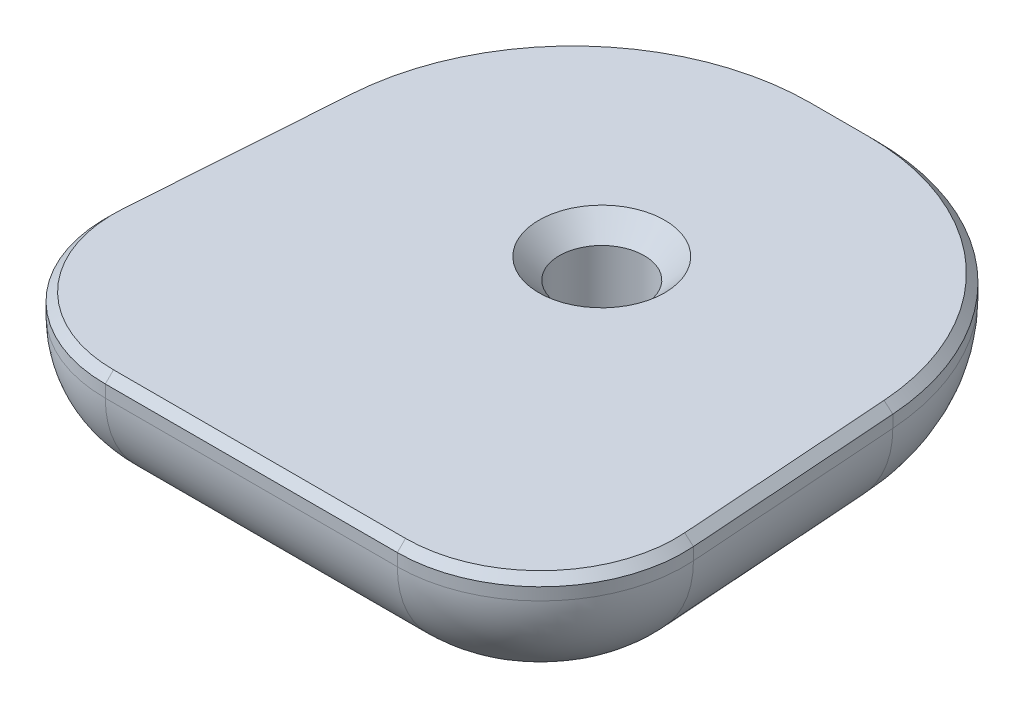
ISO-10303-21;
HEADER;
FILE_DESCRIPTION(('STEP AP214'),'2;1');
FILE_NAME('part.step','',(''),(''),'','','');
FILE_SCHEMA(('AUTOMOTIVE_DESIGN { 1 0 10303 214 1 1 1 1 }'));
ENDSEC;
DATA;
#1=APPLICATION_CONTEXT('core data for automotive mechanical design processes');
#2=APPLICATION_PROTOCOL_DEFINITION('international standard','automotive_design',2000,#1);
#3=PRODUCT_CONTEXT('',#1,'mechanical');
#4=PRODUCT('Part','Part','',(#3));
#5=PRODUCT_RELATED_PRODUCT_CATEGORY('part','',(#4));
#6=PRODUCT_DEFINITION_FORMATION('','',#4);
#7=PRODUCT_DEFINITION_CONTEXT('part definition',#1,'design');
#8=PRODUCT_DEFINITION('design','',#6,#7);
#9=PRODUCT_DEFINITION_SHAPE('','',#8);
#10=(LENGTH_UNIT() NAMED_UNIT(*) SI_UNIT(.MILLI.,.METRE.));
#11=(NAMED_UNIT(*) PLANE_ANGLE_UNIT() SI_UNIT($,.RADIAN.));
#12=(NAMED_UNIT(*) SI_UNIT($,.STERADIAN.) SOLID_ANGLE_UNIT());
#13=UNCERTAINTY_MEASURE_WITH_UNIT(LENGTH_MEASURE(1.E-05),#10,'distance_accuracy_value','');
#14=(GEOMETRIC_REPRESENTATION_CONTEXT(3) GLOBAL_UNCERTAINTY_ASSIGNED_CONTEXT((#13)) GLOBAL_UNIT_ASSIGNED_CONTEXT((#10,
#11,#12)) REPRESENTATION_CONTEXT('',''));
#15=CARTESIAN_POINT('',(0.,0.,0.));
#16=DIRECTION('',(0.,0.,1.));
#17=DIRECTION('',(1.,0.,0.));
#18=AXIS2_PLACEMENT_3D('',#15,#16,#17);
#19=CARTESIAN_POINT('',(-29.47436544682,164.,-24.29150949943));
#20=DIRECTION('',(0.,1.,0.));
#21=DIRECTION('',(1.,0.,0.));
#22=AXIS2_PLACEMENT_3D('',#19,#20,#21);
#23=PLANE('',#22);
#24=DIRECTION('',(1.,0.,0.));
#25=VECTOR('',#24,1.);
#26=CARTESIAN_POINT('',(-30.88930757944,164.,-56.));
#27=LINE('',#26,#25);
#28=CARTESIAN_POINT('',(-30.88930757944,164.,-56.));
#29=VERTEX_POINT('',#28);
#30=CARTESIAN_POINT('',(-28.05942331419,164.,-56.));
#31=VERTEX_POINT('',#30);
#32=EDGE_CURVE('E413',#29,#31,#27,.T.);
#33=ORIENTED_EDGE('',*,*,#32,.T.);
#34=CARTESIAN_POINT('',(-28.05942331419,164.,-49.));
#35=DIRECTION('',(0.,-1.,0.));
#36=DIRECTION('',(0.,0.,-1.));
#37=AXIS2_PLACEMENT_3D('',#34,#35,#36);
#38=CIRCLE('',#37,7.);
#39=CARTESIAN_POINT('',(-21.07647496236,164.,-49.48829531593));
#40=VERTEX_POINT('',#39);
#41=EDGE_CURVE('E286',#31,#40,#38,.T.);
#42=ORIENTED_EDGE('',*,*,#41,.T.);
#43=DIRECTION('',(0.0697564737049296,0.,0.997564050262565));
#44=VECTOR('',#43,1.);
#45=CARTESIAN_POINT('',(-21.07647496236,164.,-49.48829531593));
#46=LINE('',#45,#44);
#47=CARTESIAN_POINT('',(-20.34393573458,164.,-39.01249629361));
#48=VERTEX_POINT('',#47);
#49=EDGE_CURVE('E241',#40,#48,#46,.T.);
#50=ORIENTED_EDGE('',*,*,#49,.T.);
#51=CARTESIAN_POINT('',(-22.3390638351,164.,-38.8729833462));
#52=DIRECTION('',(0.,-1.,0.));
#53=DIRECTION('',(0.997564050262565,0.,-0.0697564737049296));
#54=AXIS2_PLACEMENT_3D('',#51,#52,#53);
#55=CIRCLE('',#54,2.);
#56=CARTESIAN_POINT('',(-22.3390638351,164.,-36.8729833462));
#57=VERTEX_POINT('',#56);
#58=EDGE_CURVE('E48',#48,#57,#55,.T.);
#59=ORIENTED_EDGE('',*,*,#58,.T.);
#60=DIRECTION('',(-1.,0.,0.));
#61=VECTOR('',#60,1.);
#62=CARTESIAN_POINT('',(-22.3390638351,164.,-36.8729833462));
#63=LINE('',#62,#61);
#64=CARTESIAN_POINT('',(-36.60966705853,164.,-36.8729833462));
#65=VERTEX_POINT('',#64);
#66=EDGE_CURVE('E423',#57,#65,#63,.T.);
#67=ORIENTED_EDGE('',*,*,#66,.T.);
#68=CARTESIAN_POINT('',(-36.60966705853,164.,-38.8729833462));
#69=DIRECTION('',(0.,-1.,0.));
#70=DIRECTION('',(0.,0.,1.));
#71=AXIS2_PLACEMENT_3D('',#68,#69,#70);
#72=CIRCLE('',#71,2.);
#73=CARTESIAN_POINT('',(-38.60479515906,164.,-39.01249629361));
#74=VERTEX_POINT('',#73);
#75=EDGE_CURVE('E229',#65,#74,#72,.T.);
#76=ORIENTED_EDGE('',*,*,#75,.T.);
#77=DIRECTION('',(0.0697564737049097,0.,-0.997564050262566));
#78=VECTOR('',#77,1.);
#79=CARTESIAN_POINT('',(-38.60479515906,164.,-39.01249629361));
#80=LINE('',#79,#78);
#81=CARTESIAN_POINT('',(-37.87225593128,164.,-49.48829531593));
#82=VERTEX_POINT('',#81);
#83=EDGE_CURVE('E386',#74,#82,#80,.T.);
#84=ORIENTED_EDGE('',*,*,#83,.T.);
#85=CARTESIAN_POINT('',(-30.88930757944,164.,-49.));
#86=DIRECTION('',(0.,-1.,0.));
#87=DIRECTION('',(-0.997564050262567,0.,-0.0697564737048997));
#88=AXIS2_PLACEMENT_3D('',#85,#86,#87);
#89=CIRCLE('',#88,7.);
#90=EDGE_CURVE('E390',#82,#29,#89,.T.);
#91=ORIENTED_EDGE('',*,*,#90,.T.);
#92=EDGE_LOOP('',(#33,#42,#50,#59,#67,#76,#84,#91));
#93=FACE_BOUND('',#92,.T.);
#94=CARTESIAN_POINT('',(-29.47436544682,164.,-49.));
#95=DIRECTION('',(0.,-1.,0.));
#96=DIRECTION('',(1.,0.,0.));
#97=AXIS2_PLACEMENT_3D('',#94,#95,#96);
#98=CIRCLE('',#97,3.075);
#99=CARTESIAN_POINT('',(-26.39936544682,164.,-49.));
#100=VERTEX_POINT('',#99);
#101=EDGE_CURVE('E10',#100,#100,#98,.T.);
#102=ORIENTED_EDGE('',*,*,#101,.F.);
#103=EDGE_LOOP('',(#102));
#104=FACE_BOUND('',#103,.T.);
#105=ADVANCED_FACE('F16',(#93,#104),#23,.F.);
#106=CARTESIAN_POINT('',(-29.47436544682,165.,-49.));
#107=DIRECTION('',(0.,-1.,0.));
#108=DIRECTION('',(1.,0.,0.));
#109=AXIS2_PLACEMENT_3D('',#106,#107,#108);
#110=CONICAL_SURFACE('',#109,2.075,0.785398163397);
#111=DIRECTION('',(-0.707106781186548,0.707106781186548,0.));
#112=VECTOR('',#111,1.);
#113=CARTESIAN_POINT('',(-27.39936544682,165.,-49.));
#114=LINE('',#113,#112);
#115=CARTESIAN_POINT('',(-27.39936544682,165.,-49.));
#116=VERTEX_POINT('',#115);
#117=EDGE_CURVE('E28',#100,#116,#114,.T.);
#118=ORIENTED_EDGE('',*,*,#117,.F.);
#119=ORIENTED_EDGE('',*,*,#101,.T.);
#120=ORIENTED_EDGE('',*,*,#117,.T.);
#121=CARTESIAN_POINT('',(-29.47436544682,165.,-49.));
#122=DIRECTION('',(0.,-1.,0.));
#123=DIRECTION('',(1.,0.,0.));
#124=AXIS2_PLACEMENT_3D('',#121,#122,#123);
#125=CIRCLE('',#124,2.075);
#126=EDGE_CURVE('E252',#116,#116,#125,.T.);
#127=ORIENTED_EDGE('',*,*,#126,.F.);
#128=EDGE_LOOP('',(#118,#119,#120,#127));
#129=FACE_BOUND('',#128,.T.);
#130=ADVANCED_FACE('F441',(#129),#110,.F.);
#131=CARTESIAN_POINT('',(-15.35611548326,169.,-39.36127866214));
#132=CARTESIAN_POINT('',(-15.35611548326,168.3455015305,-39.36127866214));
#133=CARTESIAN_POINT('',(-15.45867302411,167.69100415419,-39.35410714027));
#134=CARTESIAN_POINT('',(-15.6637907776,167.05668667135,-39.3397639097));
#135=CARTESIAN_POINT('',(-15.9661882197,166.4627621501,-39.31861822065));
#136=CARTESIAN_POINT('',(-16.35534126376,165.92726640012,-39.29140598894));
#137=CARTESIAN_POINT('',(-17.27868715931,165.001665788,-39.22683935417));
#138=CARTESIAN_POINT('',(-17.81287846856,164.61156247187,-39.18948505897));
#139=CARTESIAN_POINT('',(-18.40535621953,164.30842660604,-39.14805497872));
#140=CARTESIAN_POINT('',(-19.03812853686,164.1028079759,-39.10380722791));
#141=CARTESIAN_POINT('',(-19.69103159045,164.,-39.05815179889));
#142=CARTESIAN_POINT('',(-20.34393573458,164.,-39.01249629361));
#143=(BOUNDED_CURVE() B_SPLINE_CURVE(6,(#131,#132,#133,#134,#135,#136,#137,#138,#139,#140,#141,
#142),.UNSPECIFIED.,.F.,.F.) B_SPLINE_CURVE_WITH_KNOTS((7,5,7),(0.,0.785398163397,
1.570796326795),
.UNSPECIFIED.) CURVE() GEOMETRIC_REPRESENTATION_ITEM() RATIONAL_B_SPLINE_CURVE((1.,1.,1.,1.,1.,
1.,1.,1.,1.,1.,1.,1.)) REPRESENTATION_ITEM(''));
#144=CARTESIAN_POINT('',(-22.3390638351,169.,-38.8729833462));
#145=DIRECTION('',(0.,1.,0.));
#146=AXIS1_PLACEMENT('',#144,#145);
#147=SURFACE_OF_REVOLUTION('',#143,#146);
#148=CARTESIAN_POINT('',(-20.34393573458,169.,-39.01249629361));
#149=DIRECTION('',(-0.0697564737049296,0.,-0.997564050262565));
#150=DIRECTION('',(0.997564050262565,0.,-0.0697564737049296));
#151=AXIS2_PLACEMENT_3D('',#148,#149,#150);
#152=CIRCLE('',#151,5.);
#153=CARTESIAN_POINT('',(-15.35611548326,169.,-39.36127866214));
#154=VERTEX_POINT('',#153);
#155=EDGE_CURVE('E237',#154,#48,#152,.T.);
#156=ORIENTED_EDGE('',*,*,#155,.F.);
#157=CARTESIAN_POINT('',(-22.3390638351,169.,-38.8729833462));
#158=DIRECTION('',(0.,-1.,0.));
#159=DIRECTION('',(0.997564050262565,0.,-0.0697564737049296));
#160=AXIS2_PLACEMENT_3D('',#157,#158,#159);
#161=CIRCLE('',#160,7.);
#162=CARTESIAN_POINT('',(-22.3390638351,169.,-31.8729833462));
#163=VERTEX_POINT('',#162);
#164=EDGE_CURVE('E394',#154,#163,#161,.T.);
#165=ORIENTED_EDGE('',*,*,#164,.T.);
#166=CARTESIAN_POINT('',(-22.3390638351,169.,-36.8729833462));
#167=DIRECTION('',(1.,0.,0.));
#168=DIRECTION('',(0.,0.,1.));
#169=AXIS2_PLACEMENT_3D('',#166,#167,#168);
#170=CIRCLE('',#169,5.);
#171=EDGE_CURVE('E242',#163,#57,#170,.T.);
#172=ORIENTED_EDGE('',*,*,#171,.T.);
#173=ORIENTED_EDGE('',*,*,#58,.F.);
#174=EDGE_LOOP('',(#156,#165,#172,#173));
#175=FACE_BOUND('',#174,.T.);
#176=ADVANCED_FACE('F437',(#175),#147,.F.);
#177=CARTESIAN_POINT('',(-21.07647496236,169.,-49.48829531593));
#178=DIRECTION('',(0.0697564737049296,0.,0.997564050262565));
#179=DIRECTION('',(0.997564050262565,0.,-0.0697564737049296));
#180=AXIS2_PLACEMENT_3D('',#177,#178,#179);
#181=CYLINDRICAL_SURFACE('',#180,5.);
#182=DIRECTION('',(0.0697564737049296,0.,0.997564050262565));
#183=VECTOR('',#182,1.);
#184=CARTESIAN_POINT('',(-16.08865471104,169.,-49.83707768446));
#185=LINE('',#184,#183);
#186=CARTESIAN_POINT('',(-16.08865471104,169.,-49.83707768446));
#187=VERTEX_POINT('',#186);
#188=EDGE_CURVE('E385',#187,#154,#185,.T.);
#189=ORIENTED_EDGE('',*,*,#188,.T.);
#190=ORIENTED_EDGE('',*,*,#155,.T.);
#191=ORIENTED_EDGE('',*,*,#49,.F.);
#192=CARTESIAN_POINT('',(-21.07647496236,169.,-49.48829531593));
#193=DIRECTION('',(-0.0697564737049296,0.,-0.997564050262565));
#194=DIRECTION('',(0.997564050262565,0.,-0.0697564737049296));
#195=AXIS2_PLACEMENT_3D('',#192,#193,#194);
#196=CIRCLE('',#195,5.);
#197=EDGE_CURVE('E232',#187,#40,#196,.T.);
#198=ORIENTED_EDGE('',*,*,#197,.F.);
#199=EDGE_LOOP('',(#189,#190,#191,#198));
#200=FACE_BOUND('',#199,.T.);
#201=ADVANCED_FACE('F440',(#200),#181,.T.);
#202=CARTESIAN_POINT('',(-22.3390638351,169.,-36.8729833462));
#203=DIRECTION('',(-1.,0.,0.));
#204=DIRECTION('',(0.,0.,1.));
#205=AXIS2_PLACEMENT_3D('',#202,#203,#204);
#206=CYLINDRICAL_SURFACE('',#205,5.);
#207=DIRECTION('',(-1.,0.,0.));
#208=VECTOR('',#207,1.);
#209=CARTESIAN_POINT('',(-22.3390638351,169.,-31.8729833462));
#210=LINE('',#209,#208);
#211=CARTESIAN_POINT('',(-36.60966705853,169.,-31.8729833462));
#212=VERTEX_POINT('',#211);
#213=EDGE_CURVE('E376',#163,#212,#210,.T.);
#214=ORIENTED_EDGE('',*,*,#213,.T.);
#215=CARTESIAN_POINT('',(-36.60966705853,169.,-36.8729833462));
#216=DIRECTION('',(1.,0.,0.));
#217=DIRECTION('',(0.,0.,1.));
#218=AXIS2_PLACEMENT_3D('',#215,#216,#217);
#219=CIRCLE('',#218,5.);
#220=EDGE_CURVE('E233',#212,#65,#219,.T.);
#221=ORIENTED_EDGE('',*,*,#220,.T.);
#222=ORIENTED_EDGE('',*,*,#66,.F.);
#223=ORIENTED_EDGE('',*,*,#171,.F.);
#224=EDGE_LOOP('',(#214,#221,#222,#223));
#225=FACE_BOUND('',#224,.T.);
#226=ADVANCED_FACE('F449',(#225),#206,.T.);
#227=CARTESIAN_POINT('',(-28.05942331419,169.,-49.));
#228=DIRECTION('',(0.,-1.,0.));
#229=DIRECTION('',(0.,0.,-1.));
#230=AXIS2_PLACEMENT_3D('',#227,#228,#229);
#231=TOROIDAL_SURFACE('',#230,7.,5.);
#232=CARTESIAN_POINT('',(-28.05942331419,169.,-56.));
#233=DIRECTION('',(-1.,0.,0.));
#234=DIRECTION('',(0.,0.,-1.));
#235=AXIS2_PLACEMENT_3D('',#232,#233,#234);
#236=CIRCLE('',#235,5.);
#237=CARTESIAN_POINT('',(-28.05942331419,169.,-61.));
#238=VERTEX_POINT('',#237);
#239=EDGE_CURVE('E409',#238,#31,#236,.T.);
#240=ORIENTED_EDGE('',*,*,#239,.F.);
#241=CARTESIAN_POINT('',(-28.05942331419,169.,-49.));
#242=DIRECTION('',(0.,-1.,0.));
#243=DIRECTION('',(0.,0.,-1.));
#244=AXIS2_PLACEMENT_3D('',#241,#242,#243);
#245=CIRCLE('',#244,12.);
#246=EDGE_CURVE('E372',#238,#187,#245,.T.);
#247=ORIENTED_EDGE('',*,*,#246,.T.);
#248=ORIENTED_EDGE('',*,*,#197,.T.);
#249=ORIENTED_EDGE('',*,*,#41,.F.);
#250=EDGE_LOOP('',(#240,#247,#248,#249));
#251=FACE_BOUND('',#250,.T.);
#252=ADVANCED_FACE('F453',(#251),#231,.T.);
#253=CARTESIAN_POINT('',(-36.60966705853,169.,-31.8729833462));
#254=CARTESIAN_POINT('',(-36.60966705853,168.3455015305,-31.8729833462));
#255=CARTESIAN_POINT('',(-36.60966705853,167.69100415419,-31.97579132211));
#256=CARTESIAN_POINT('',(-36.60966705853,167.05668667135,-32.18140995225));
#257=CARTESIAN_POINT('',(-36.60966705853,166.4627621501,-32.48454581808));
#258=CARTESIAN_POINT('',(-36.60966705853,165.92726640012,-32.87464913421));
#259=CARTESIAN_POINT('',(-36.60966705853,165.001665788,-33.80024974633));
#260=CARTESIAN_POINT('',(-36.60966705853,164.61156247187,-34.33574549631));
#261=CARTESIAN_POINT('',(-36.60966705853,164.30842660604,-34.92967001756));
#262=CARTESIAN_POINT('',(-36.60966705853,164.1028079759,-35.5639875004));
#263=CARTESIAN_POINT('',(-36.60966705853,164.,-36.21848487671));
#264=CARTESIAN_POINT('',(-36.60966705853,164.,-36.8729833462));
#265=(BOUNDED_CURVE() B_SPLINE_CURVE(6,(#253,#254,#255,#256,#257,#258,#259,#260,#261,#262,#263,
#264),.UNSPECIFIED.,.F.,.F.) B_SPLINE_CURVE_WITH_KNOTS((7,5,7),(0.,0.785398163397,
1.570796326795),
.UNSPECIFIED.) CURVE() GEOMETRIC_REPRESENTATION_ITEM() RATIONAL_B_SPLINE_CURVE((1.,1.,1.,1.,1.,
1.,1.,1.,1.,1.,1.,1.)) REPRESENTATION_ITEM(''));
#266=CARTESIAN_POINT('',(-36.60966705853,169.,-38.8729833462));
#267=DIRECTION('',(0.,1.,0.));
#268=AXIS1_PLACEMENT('',#266,#267);
#269=SURFACE_OF_REVOLUTION('',#265,#268);
#270=ORIENTED_EDGE('',*,*,#220,.F.);
#271=CARTESIAN_POINT('',(-36.60966705853,169.,-38.8729833462));
#272=DIRECTION('',(0.,-1.,0.));
#273=DIRECTION('',(0.,0.,1.));
#274=AXIS2_PLACEMENT_3D('',#271,#272,#273);
#275=CIRCLE('',#274,7.);
#276=CARTESIAN_POINT('',(-43.59261541037,169.,-39.36127866214));
#277=VERTEX_POINT('',#276);
#278=EDGE_CURVE('E360',#212,#277,#275,.T.);
#279=ORIENTED_EDGE('',*,*,#278,.T.);
#280=CARTESIAN_POINT('',(-38.60479515906,169.,-39.01249629361));
#281=DIRECTION('',(-0.0697564737048997,0.,0.997564050262567));
#282=DIRECTION('',(-0.997564050262567,0.,-0.0697564737048997));
#283=AXIS2_PLACEMENT_3D('',#280,#281,#282);
#284=CIRCLE('',#283,5.);
#285=EDGE_CURVE('E389',#277,#74,#284,.T.);
#286=ORIENTED_EDGE('',*,*,#285,.T.);
#287=ORIENTED_EDGE('',*,*,#75,.F.);
#288=EDGE_LOOP('',(#270,#279,#286,#287));
#289=FACE_BOUND('',#288,.T.);
#290=ADVANCED_FACE('F18',(#289),#269,.F.);
#291=CARTESIAN_POINT('',(-30.88930757944,169.,-56.));
#292=DIRECTION('',(1.,0.,0.));
#293=DIRECTION('',(0.,0.,-1.));
#294=AXIS2_PLACEMENT_3D('',#291,#292,#293);
#295=CYLINDRICAL_SURFACE('',#294,5.);
#296=DIRECTION('',(1.,0.,0.));
#297=VECTOR('',#296,1.);
#298=CARTESIAN_POINT('',(-30.88930757944,169.,-61.));
#299=LINE('',#298,#297);
#300=CARTESIAN_POINT('',(-30.88930757944,169.,-61.));
#301=VERTEX_POINT('',#300);
#302=EDGE_CURVE('E356',#301,#238,#299,.T.);
#303=ORIENTED_EDGE('',*,*,#302,.T.);
#304=ORIENTED_EDGE('',*,*,#239,.T.);
#305=ORIENTED_EDGE('',*,*,#32,.F.);
#306=CARTESIAN_POINT('',(-30.88930757944,169.,-56.));
#307=DIRECTION('',(-1.,0.,0.));
#308=DIRECTION('',(0.,0.,-1.));
#309=AXIS2_PLACEMENT_3D('',#306,#307,#308);
#310=CIRCLE('',#309,5.);
#311=EDGE_CURVE('E251',#301,#29,#310,.T.);
#312=ORIENTED_EDGE('',*,*,#311,.F.);
#313=EDGE_LOOP('',(#303,#304,#305,#312));
#314=FACE_BOUND('',#313,.T.);
#315=ADVANCED_FACE('F458',(#314),#295,.T.);
#316=CARTESIAN_POINT('',(-38.60479515906,169.,-39.01249629361));
#317=DIRECTION('',(0.0697564737049097,0.,-0.997564050262566));
#318=DIRECTION('',(-0.997564050262566,0.,-0.0697564737049097));
#319=AXIS2_PLACEMENT_3D('',#316,#317,#318);
#320=CYLINDRICAL_SURFACE('',#319,5.);
#321=DIRECTION('',(0.0697564737049097,0.,-0.997564050262566));
#322=VECTOR('',#321,1.);
#323=CARTESIAN_POINT('',(-43.59261541037,169.,-39.36127866214));
#324=LINE('',#323,#322);
#325=CARTESIAN_POINT('',(-42.86007618259,169.,-49.83707768445));
#326=VERTEX_POINT('',#325);
#327=EDGE_CURVE('E348',#277,#326,#324,.T.);
#328=ORIENTED_EDGE('',*,*,#327,.T.);
#329=CARTESIAN_POINT('',(-37.87225593128,169.,-49.48829531593));
#330=DIRECTION('',(-0.0697564737048997,0.,0.997564050262567));
#331=DIRECTION('',(-0.997564050262567,0.,-0.0697564737048997));
#332=AXIS2_PLACEMENT_3D('',#329,#330,#331);
#333=CIRCLE('',#332,5.);
#334=EDGE_CURVE('E247',#326,#82,#333,.T.);
#335=ORIENTED_EDGE('',*,*,#334,.T.);
#336=ORIENTED_EDGE('',*,*,#83,.F.);
#337=ORIENTED_EDGE('',*,*,#285,.F.);
#338=EDGE_LOOP('',(#328,#335,#336,#337));
#339=FACE_BOUND('',#338,.T.);
#340=ADVANCED_FACE('F461',(#339),#320,.T.);
#341=CARTESIAN_POINT('',(-30.88930757944,169.,-49.));
#342=DIRECTION('',(0.,-1.,0.));
#343=DIRECTION('',(-0.997564050262567,0.,-0.0697564737048997));
#344=AXIS2_PLACEMENT_3D('',#341,#342,#343);
#345=TOROIDAL_SURFACE('',#344,7.,5.);
#346=ORIENTED_EDGE('',*,*,#334,.F.);
#347=CARTESIAN_POINT('',(-30.88930757944,169.,-49.));
#348=DIRECTION('',(0.,-1.,0.));
#349=DIRECTION('',(-0.997564050262567,0.,-0.0697564737048997));
#350=AXIS2_PLACEMENT_3D('',#347,#348,#349);
#351=CIRCLE('',#350,12.);
#352=EDGE_CURVE('E336',#326,#301,#351,.T.);
#353=ORIENTED_EDGE('',*,*,#352,.T.);
#354=ORIENTED_EDGE('',*,*,#311,.T.);
#355=ORIENTED_EDGE('',*,*,#90,.F.);
#356=EDGE_LOOP('',(#346,#353,#354,#355));
#357=FACE_BOUND('',#356,.T.);
#358=ADVANCED_FACE('F465',(#357),#345,.T.);
#359=CARTESIAN_POINT('',(-29.47436544682,164.,-49.));
#360=DIRECTION('',(0.,-1.,0.));
#361=DIRECTION('',(1.,0.,0.));
#362=AXIS2_PLACEMENT_3D('',#359,#360,#361);
#363=CYLINDRICAL_SURFACE('',#362,2.075);
#364=CARTESIAN_POINT('',(-29.47436544682,169.,-49.));
#365=DIRECTION('',(0.,-1.,0.));
#366=DIRECTION('',(1.,0.,0.));
#367=AXIS2_PLACEMENT_3D('',#364,#365,#366);
#368=CIRCLE('',#367,2.075);
#369=CARTESIAN_POINT('',(-27.39936544682,169.,-49.));
#370=VERTEX_POINT('',#369);
#371=EDGE_CURVE('E320',#370,#370,#368,.T.);
#372=ORIENTED_EDGE('',*,*,#371,.F.);
#373=DIRECTION('',(0.,1.,0.));
#374=VECTOR('',#373,1.);
#375=CARTESIAN_POINT('',(-27.39936544682,164.,-49.));
#376=LINE('',#375,#374);
#377=EDGE_CURVE('E332',#116,#370,#376,.T.);
#378=ORIENTED_EDGE('',*,*,#377,.F.);
#379=ORIENTED_EDGE('',*,*,#126,.T.);
#380=ORIENTED_EDGE('',*,*,#377,.T.);
#381=EDGE_LOOP('',(#372,#378,#379,#380));
#382=FACE_BOUND('',#381,.T.);
#383=ADVANCED_FACE('F469',(#382),#363,.F.);
#384=CARTESIAN_POINT('',(-22.3390638351,170.,-38.8729833462));
#385=DIRECTION('',(0.,-1.,0.));
#386=DIRECTION('',(0.,0.,1.));
#387=AXIS2_PLACEMENT_3D('',#384,#385,#386);
#388=CYLINDRICAL_SURFACE('',#387,7.);
#389=ORIENTED_EDGE('',*,*,#164,.F.);
#390=DIRECTION('',(0.,-1.,0.));
#391=VECTOR('',#390,1.);
#392=CARTESIAN_POINT('',(-15.35611548326,170.,-39.36127866214));
#393=LINE('',#392,#391);
#394=CARTESIAN_POINT('',(-15.35611548326,169.6,-39.36127866214));
#395=VERTEX_POINT('',#394);
#396=EDGE_CURVE('E381',#395,#154,#393,.T.);
#397=ORIENTED_EDGE('',*,*,#396,.F.);
#398=CARTESIAN_POINT('',(-22.3390638351,169.6,-38.8729833462));
#399=DIRECTION('',(0.,-1.,0.));
#400=DIRECTION('',(0.997564050262565,0.,-0.0697564737049296));
#401=AXIS2_PLACEMENT_3D('',#398,#399,#400);
#402=CIRCLE('',#401,7.);
#403=CARTESIAN_POINT('',(-22.3390638351,169.6,-31.8729833462));
#404=VERTEX_POINT('',#403);
#405=EDGE_CURVE('E316',#395,#404,#402,.T.);
#406=ORIENTED_EDGE('',*,*,#405,.T.);
#407=DIRECTION('',(0.,-1.,0.));
#408=VECTOR('',#407,1.);
#409=CARTESIAN_POINT('',(-22.3390638351,170.,-31.8729833462));
#410=LINE('',#409,#408);
#411=EDGE_CURVE('E377',#404,#163,#410,.T.);
#412=ORIENTED_EDGE('',*,*,#411,.T.);
#413=EDGE_LOOP('',(#389,#397,#406,#412));
#414=FACE_BOUND('',#413,.T.);
#415=ADVANCED_FACE('F471',(#414),#388,.T.);
#416=CARTESIAN_POINT('',(-14.83248286523,170.,-31.8729833462));
#417=DIRECTION('',(0.997564050262565,0.,-0.0697564737049296));
#418=DIRECTION('',(0.,-1.,0.));
#419=AXIS2_PLACEMENT_3D('',#416,#417,#418);
#420=PLANE('',#419);
#421=ORIENTED_EDGE('',*,*,#396,.T.);
#422=ORIENTED_EDGE('',*,*,#188,.F.);
#423=DIRECTION('',(0.,-1.,0.));
#424=VECTOR('',#423,1.);
#425=CARTESIAN_POINT('',(-16.08865471104,170.,-49.83707768446));
#426=LINE('',#425,#424);
#427=CARTESIAN_POINT('',(-16.08865471104,169.6,-49.83707768446));
#428=VERTEX_POINT('',#427);
#429=EDGE_CURVE('E368',#428,#187,#426,.T.);
#430=ORIENTED_EDGE('',*,*,#429,.F.);
#431=DIRECTION('',(0.0697564737049296,0.,0.997564050262565));
#432=VECTOR('',#431,1.);
#433=CARTESIAN_POINT('',(-16.08865471104,169.6,-49.83707768446));
#434=LINE('',#433,#432);
#435=EDGE_CURVE('E312',#428,#395,#434,.T.);
#436=ORIENTED_EDGE('',*,*,#435,.T.);
#437=EDGE_LOOP('',(#421,#422,#430,#436));
#438=FACE_BOUND('',#437,.T.);
#439=ADVANCED_FACE('F474',(#438),#420,.T.);
#440=CARTESIAN_POINT('',(-14.83248286523,170.,-31.8729833462));
#441=DIRECTION('',(0.,0.,-1.));
#442=DIRECTION('',(0.,-1.,0.));
#443=AXIS2_PLACEMENT_3D('',#440,#441,#442);
#444=PLANE('',#443);
#445=DIRECTION('',(-1.,0.,0.));
#446=VECTOR('',#445,1.);
#447=CARTESIAN_POINT('',(-22.3390638351,169.6,-31.8729833462));
#448=LINE('',#447,#446);
#449=CARTESIAN_POINT('',(-36.60966705853,169.6,-31.8729833462));
#450=VERTEX_POINT('',#449);
#451=EDGE_CURVE('E304',#404,#450,#448,.T.);
#452=ORIENTED_EDGE('',*,*,#451,.T.);
#453=DIRECTION('',(0.,-1.,0.));
#454=VECTOR('',#453,1.);
#455=CARTESIAN_POINT('',(-36.60966705853,170.,-31.8729833462));
#456=LINE('',#455,#454);
#457=EDGE_CURVE('E364',#450,#212,#456,.T.);
#458=ORIENTED_EDGE('',*,*,#457,.T.);
#459=ORIENTED_EDGE('',*,*,#213,.F.);
#460=ORIENTED_EDGE('',*,*,#411,.F.);
#461=EDGE_LOOP('',(#452,#458,#459,#460));
#462=FACE_BOUND('',#461,.T.);
#463=ADVANCED_FACE('F478',(#462),#444,.F.);
#464=CARTESIAN_POINT('',(-28.05942331419,170.,-49.));
#465=DIRECTION('',(0.,1.,0.));
#466=DIRECTION('',(0.,0.,-1.));
#467=AXIS2_PLACEMENT_3D('',#464,#465,#466);
#468=CYLINDRICAL_SURFACE('',#467,12.);
#469=ORIENTED_EDGE('',*,*,#429,.T.);
#470=ORIENTED_EDGE('',*,*,#246,.F.);
#471=DIRECTION('',(0.,-1.,0.));
#472=VECTOR('',#471,1.);
#473=CARTESIAN_POINT('',(-28.05942331419,170.,-61.));
#474=LINE('',#473,#472);
#475=CARTESIAN_POINT('',(-28.05942331419,169.6,-61.));
#476=VERTEX_POINT('',#475);
#477=EDGE_CURVE('E352',#476,#238,#474,.T.);
#478=ORIENTED_EDGE('',*,*,#477,.F.);
#479=CARTESIAN_POINT('',(-28.05942331419,169.6,-49.));
#480=DIRECTION('',(0.,-1.,0.));
#481=DIRECTION('',(0.,0.,-1.));
#482=AXIS2_PLACEMENT_3D('',#479,#480,#481);
#483=CIRCLE('',#482,12.);
#484=EDGE_CURVE('E296',#476,#428,#483,.T.);
#485=ORIENTED_EDGE('',*,*,#484,.T.);
#486=EDGE_LOOP('',(#469,#470,#478,#485));
#487=FACE_BOUND('',#486,.T.);
#488=ADVANCED_FACE('F482',(#487),#468,.T.);
#489=CARTESIAN_POINT('',(-36.60966705853,170.,-38.8729833462));
#490=DIRECTION('',(0.,-1.,0.));
#491=DIRECTION('',(-0.997564050262566,0.,-0.0697564737049097));
#492=AXIS2_PLACEMENT_3D('',#489,#490,#491);
#493=CYLINDRICAL_SURFACE('',#492,7.);
#494=ORIENTED_EDGE('',*,*,#278,.F.);
#495=ORIENTED_EDGE('',*,*,#457,.F.);
#496=CARTESIAN_POINT('',(-36.60966705853,169.6,-38.8729833462));
#497=DIRECTION('',(0.,-1.,0.));
#498=DIRECTION('',(0.,0.,1.));
#499=AXIS2_PLACEMENT_3D('',#496,#497,#498);
#500=CIRCLE('',#499,7.);
#501=CARTESIAN_POINT('',(-43.59261541037,169.6,-39.36127866214));
#502=VERTEX_POINT('',#501);
#503=EDGE_CURVE('E282',#450,#502,#500,.T.);
#504=ORIENTED_EDGE('',*,*,#503,.T.);
#505=DIRECTION('',(0.,-1.,0.));
#506=VECTOR('',#505,1.);
#507=CARTESIAN_POINT('',(-43.59261541037,170.,-39.36127866214));
#508=LINE('',#507,#506);
#509=EDGE_CURVE('E344',#502,#277,#508,.T.);
#510=ORIENTED_EDGE('',*,*,#509,.T.);
#511=EDGE_LOOP('',(#494,#495,#504,#510));
#512=FACE_BOUND('',#511,.T.);
#513=ADVANCED_FACE('F484',(#512),#493,.T.);
#514=CARTESIAN_POINT('',(-28.05942331419,170.,-61.));
#515=DIRECTION('',(0.,0.,-1.));
#516=DIRECTION('',(0.,-1.,0.));
#517=AXIS2_PLACEMENT_3D('',#514,#515,#516);
#518=PLANE('',#517);
#519=ORIENTED_EDGE('',*,*,#477,.T.);
#520=ORIENTED_EDGE('',*,*,#302,.F.);
#521=DIRECTION('',(0.,-1.,0.));
#522=VECTOR('',#521,1.);
#523=CARTESIAN_POINT('',(-30.88930757944,170.,-61.));
#524=LINE('',#523,#522);
#525=CARTESIAN_POINT('',(-30.88930757944,169.6,-61.));
#526=VERTEX_POINT('',#525);
#527=EDGE_CURVE('E328',#526,#301,#524,.T.);
#528=ORIENTED_EDGE('',*,*,#527,.F.);
#529=DIRECTION('',(1.,0.,0.));
#530=VECTOR('',#529,1.);
#531=CARTESIAN_POINT('',(-30.88930757944,169.6,-61.));
#532=LINE('',#531,#530);
#533=EDGE_CURVE('E253',#526,#476,#532,.T.);
#534=ORIENTED_EDGE('',*,*,#533,.T.);
#535=EDGE_LOOP('',(#519,#520,#528,#534));
#536=FACE_BOUND('',#535,.T.);
#537=ADVANCED_FACE('F487',(#536),#518,.T.);
#538=CARTESIAN_POINT('',(-42.86007618259,170.,-49.83707768445));
#539=DIRECTION('',(-0.997564050262566,0.,-0.0697564737049097));
#540=DIRECTION('',(-0.0697564737049097,0.,0.997564050262566));
#541=AXIS2_PLACEMENT_3D('',#538,#539,#540);
#542=PLANE('',#541);
#543=ORIENTED_EDGE('',*,*,#509,.F.);
#544=DIRECTION('',(0.0697564737049097,0.,-0.997564050262566));
#545=VECTOR('',#544,1.);
#546=CARTESIAN_POINT('',(-43.59261541037,169.6,-39.36127866214));
#547=LINE('',#546,#545);
#548=CARTESIAN_POINT('',(-42.86007618259,169.6,-49.83707768445));
#549=VERTEX_POINT('',#548);
#550=EDGE_CURVE('E228',#502,#549,#547,.T.);
#551=ORIENTED_EDGE('',*,*,#550,.T.);
#552=DIRECTION('',(0.,-1.,0.));
#553=VECTOR('',#552,1.);
#554=CARTESIAN_POINT('',(-42.86007618259,170.,-49.83707768445));
#555=LINE('',#554,#553);
#556=EDGE_CURVE('E340',#549,#326,#555,.T.);
#557=ORIENTED_EDGE('',*,*,#556,.T.);
#558=ORIENTED_EDGE('',*,*,#327,.F.);
#559=EDGE_LOOP('',(#543,#551,#557,#558));
#560=FACE_BOUND('',#559,.T.);
#561=ADVANCED_FACE('F492',(#560),#542,.T.);
#562=CARTESIAN_POINT('',(-30.88930757944,170.,-49.));
#563=DIRECTION('',(0.,1.,0.));
#564=DIRECTION('',(0.,0.,-1.));
#565=AXIS2_PLACEMENT_3D('',#562,#563,#564);
#566=CYLINDRICAL_SURFACE('',#565,12.);
#567=CARTESIAN_POINT('',(-30.88930757944,169.6,-49.));
#568=DIRECTION('',(0.,-1.,0.));
#569=DIRECTION('',(-0.997564050262567,0.,-0.0697564737048997));
#570=AXIS2_PLACEMENT_3D('',#567,#568,#569);
#571=CIRCLE('',#570,12.);
#572=EDGE_CURVE('E194',#549,#526,#571,.T.);
#573=ORIENTED_EDGE('',*,*,#572,.T.);
#574=ORIENTED_EDGE('',*,*,#527,.T.);
#575=ORIENTED_EDGE('',*,*,#352,.F.);
#576=ORIENTED_EDGE('',*,*,#556,.F.);
#577=EDGE_LOOP('',(#573,#574,#575,#576));
#578=FACE_BOUND('',#577,.T.);
#579=ADVANCED_FACE('F495',(#578),#566,.T.);
#580=CARTESIAN_POINT('',(-29.47436544682,169.,-49.));
#581=DIRECTION('',(0.,1.,0.));
#582=DIRECTION('',(1.,0.,0.));
#583=AXIS2_PLACEMENT_3D('',#580,#581,#582);
#584=CONICAL_SURFACE('',#583,2.075,0.785398163397);
#585=ORIENTED_EDGE('',*,*,#371,.T.);
#586=DIRECTION('',(-0.707106781186548,-0.707106781186548,0.));
#587=VECTOR('',#586,1.);
#588=CARTESIAN_POINT('',(-27.39936544682,169.,-49.));
#589=LINE('',#588,#587);
#590=CARTESIAN_POINT('',(-26.39936544682,170.,-49.));
#591=VERTEX_POINT('',#590);
#592=EDGE_CURVE('E324',#591,#370,#589,.T.);
#593=ORIENTED_EDGE('',*,*,#592,.F.);
#594=CARTESIAN_POINT('',(-29.47436544682,170.,-49.));
#595=DIRECTION('',(0.,-1.,0.));
#596=DIRECTION('',(1.,0.,0.));
#597=AXIS2_PLACEMENT_3D('',#594,#595,#596);
#598=CIRCLE('',#597,3.075);
#599=EDGE_CURVE('E199',#591,#591,#598,.T.);
#600=ORIENTED_EDGE('',*,*,#599,.F.);
#601=ORIENTED_EDGE('',*,*,#592,.T.);
#602=EDGE_LOOP('',(#585,#593,#600,#601));
#603=FACE_BOUND('',#602,.T.);
#604=ADVANCED_FACE('F502',(#603),#584,.F.);
#605=CARTESIAN_POINT('',(-22.3390638351,169.6,-38.8729833462));
#606=DIRECTION('',(0.,-1.,0.));
#607=DIRECTION('',(0.997564050262565,0.,-0.0697564737049296));
#608=AXIS2_PLACEMENT_3D('',#605,#606,#607);
#609=CONICAL_SURFACE('',#608,7.,0.785398163397);
#610=DIRECTION('',(0.705384304608563,-0.707106781186562,-0.0493252755884095));
#611=VECTOR('',#610,1.);
#612=CARTESIAN_POINT('',(-15.55562829332,169.8,-39.3473273674));
#613=LINE('',#612,#611);
#614=CARTESIAN_POINT('',(-15.75514110337,170.,-39.33337607266));
#615=VERTEX_POINT('',#614);
#616=EDGE_CURVE('E308',#615,#395,#613,.T.);
#617=ORIENTED_EDGE('',*,*,#616,.F.);
#618=CARTESIAN_POINT('',(-22.3390638351,170.,-38.8729833462));
#619=DIRECTION('',(0.,-1.,0.));
#620=DIRECTION('',(0.997564050262565,0.,-0.0697564737049296));
#621=AXIS2_PLACEMENT_3D('',#618,#619,#620);
#622=CIRCLE('',#621,6.6);
#623=CARTESIAN_POINT('',(-22.3390638351,170.,-32.2729833462));
#624=VERTEX_POINT('',#623);
#625=EDGE_CURVE('E246',#615,#624,#622,.T.);
#626=ORIENTED_EDGE('',*,*,#625,.T.);
#627=DIRECTION('',(0.,-0.707106781186548,0.707106781186548));
#628=VECTOR('',#627,1.);
#629=CARTESIAN_POINT('',(-22.3390638351,169.6,-31.8729833462));
#630=LINE('',#629,#628);
#631=EDGE_CURVE('E300',#624,#404,#630,.T.);
#632=ORIENTED_EDGE('',*,*,#631,.T.);
#633=ORIENTED_EDGE('',*,*,#405,.F.);
#634=EDGE_LOOP('',(#617,#626,#632,#633));
#635=FACE_BOUND('',#634,.T.);
#636=ADVANCED_FACE('F506',(#635),#609,.T.);
#637=CARTESIAN_POINT('',(-16.2881675211,169.8,-49.82312638971));
#638=DIRECTION('',(0.705384304608563,0.707106781186562,-0.0493252755884095));
#639=DIRECTION('',(-0.0697564737049207,0.,-0.997564050262566));
#640=AXIS2_PLACEMENT_3D('',#637,#638,#639);
#641=PLANE('',#640);
#642=DIRECTION('',(0.705384304608563,-0.707106781186562,-0.0493252755884095));
#643=VECTOR('',#642,1.);
#644=CARTESIAN_POINT('',(-16.08865471104,169.6,-49.83707768446));
#645=LINE('',#644,#643);
#646=CARTESIAN_POINT('',(-16.48768033115,170.,-49.80917509497));
#647=VERTEX_POINT('',#646);
#648=EDGE_CURVE('E290',#647,#428,#645,.T.);
#649=ORIENTED_EDGE('',*,*,#648,.F.);
#650=DIRECTION('',(0.0697564737049296,0.,0.997564050262565));
#651=VECTOR('',#650,1.);
#652=CARTESIAN_POINT('',(-16.48768033115,170.,-49.80917509497));
#653=LINE('',#652,#651);
#654=EDGE_CURVE('E223',#647,#615,#653,.T.);
#655=ORIENTED_EDGE('',*,*,#654,.T.);
#656=ORIENTED_EDGE('',*,*,#616,.T.);
#657=ORIENTED_EDGE('',*,*,#435,.F.);
#658=EDGE_LOOP('',(#649,#655,#656,#657));
#659=FACE_BOUND('',#658,.T.);
#660=ADVANCED_FACE('F512',(#659),#641,.T.);
#661=CARTESIAN_POINT('',(-22.3390638351,169.8,-32.0729833462));
#662=DIRECTION('',(0.,-0.707106781186548,-0.707106781186548));
#663=DIRECTION('',(0.,-0.707106781186548,0.707106781186548));
#664=AXIS2_PLACEMENT_3D('',#661,#662,#663);
#665=PLANE('',#664);
#666=ORIENTED_EDGE('',*,*,#631,.F.);
#667=DIRECTION('',(-1.,0.,0.));
#668=VECTOR('',#667,1.);
#669=CARTESIAN_POINT('',(-22.3390638351,170.,-32.2729833462));
#670=LINE('',#669,#668);
#671=CARTESIAN_POINT('',(-36.60966705853,170.,-32.2729833462));
#672=VERTEX_POINT('',#671);
#673=EDGE_CURVE('E236',#624,#672,#670,.T.);
#674=ORIENTED_EDGE('',*,*,#673,.T.);
#675=DIRECTION('',(0.,-0.707106781186548,0.707106781186548));
#676=VECTOR('',#675,1.);
#677=CARTESIAN_POINT('',(-36.60966705853,169.8,-32.0729833462));
#678=LINE('',#677,#676);
#679=EDGE_CURVE('E257',#672,#450,#678,.T.);
#680=ORIENTED_EDGE('',*,*,#679,.T.);
#681=ORIENTED_EDGE('',*,*,#451,.F.);
#682=EDGE_LOOP('',(#666,#674,#680,#681));
#683=FACE_BOUND('',#682,.T.);
#684=ADVANCED_FACE('F508',(#683),#665,.F.);
#685=CARTESIAN_POINT('',(-28.05942331419,169.6,-49.));
#686=DIRECTION('',(0.,-1.,0.));
#687=DIRECTION('',(0.,0.,-1.));
#688=AXIS2_PLACEMENT_3D('',#685,#686,#687);
#689=CONICAL_SURFACE('',#688,12.,0.785398163397);
#690=DIRECTION('',(0.,-0.707106781186548,-0.707106781186548));
#691=VECTOR('',#690,1.);
#692=CARTESIAN_POINT('',(-28.05942331419,169.8,-60.8));
#693=LINE('',#692,#691);
#694=CARTESIAN_POINT('',(-28.05942331419,170.,-60.6));
#695=VERTEX_POINT('',#694);
#696=EDGE_CURVE('E258',#695,#476,#693,.T.);
#697=ORIENTED_EDGE('',*,*,#696,.F.);
#698=CARTESIAN_POINT('',(-28.05942331419,170.,-49.));
#699=DIRECTION('',(0.,-1.,0.));
#700=DIRECTION('',(0.,0.,-1.));
#701=AXIS2_PLACEMENT_3D('',#698,#699,#700);
#702=CIRCLE('',#701,11.6);
#703=EDGE_CURVE('E262',#695,#647,#702,.T.);
#704=ORIENTED_EDGE('',*,*,#703,.T.);
#705=ORIENTED_EDGE('',*,*,#648,.T.);
#706=ORIENTED_EDGE('',*,*,#484,.F.);
#707=EDGE_LOOP('',(#697,#704,#705,#706));
#708=FACE_BOUND('',#707,.T.);
#709=ADVANCED_FACE('F511',(#708),#689,.T.);
#710=CARTESIAN_POINT('',(-36.60966705853,169.6,-38.8729833462));
#711=DIRECTION('',(0.,-1.,0.));
#712=DIRECTION('',(0.,0.,1.));
#713=AXIS2_PLACEMENT_3D('',#710,#711,#712);
#714=CONICAL_SURFACE('',#713,7.,0.785398163397);
#715=ORIENTED_EDGE('',*,*,#679,.F.);
#716=CARTESIAN_POINT('',(-36.60966705853,170.,-38.8729833462));
#717=DIRECTION('',(0.,-1.,0.));
#718=DIRECTION('',(0.,0.,1.));
#719=AXIS2_PLACEMENT_3D('',#716,#717,#718);
#720=CIRCLE('',#719,6.6);
#721=CARTESIAN_POINT('',(-43.19358979027,170.,-39.33337607266));
#722=VERTEX_POINT('',#721);
#723=EDGE_CURVE('E210',#672,#722,#720,.T.);
#724=ORIENTED_EDGE('',*,*,#723,.T.);
#725=DIRECTION('',(-0.705384304608564,-0.707106781186563,-0.0493252755883895));
#726=VECTOR('',#725,1.);
#727=CARTESIAN_POINT('',(-43.59261541037,169.6,-39.36127866214));
#728=LINE('',#727,#726);
#729=EDGE_CURVE('E205',#722,#502,#728,.T.);
#730=ORIENTED_EDGE('',*,*,#729,.T.);
#731=ORIENTED_EDGE('',*,*,#503,.F.);
#732=EDGE_LOOP('',(#715,#724,#730,#731));
#733=FACE_BOUND('',#732,.T.);
#734=ADVANCED_FACE('F516',(#733),#714,.T.);
#735=CARTESIAN_POINT('',(-30.88930757944,169.8,-60.8));
#736=DIRECTION('',(0.,0.707106781186548,-0.707106781186548));
#737=DIRECTION('',(-1.,0.,0.));
#738=AXIS2_PLACEMENT_3D('',#735,#736,#737);
#739=PLANE('',#738);
#740=DIRECTION('',(0.,-0.707106781186548,-0.707106781186548));
#741=VECTOR('',#740,1.);
#742=CARTESIAN_POINT('',(-30.88930757944,169.6,-61.));
#743=LINE('',#742,#741);
#744=CARTESIAN_POINT('',(-30.88930757944,170.,-60.6));
#745=VERTEX_POINT('',#744);
#746=EDGE_CURVE('E198',#745,#526,#743,.T.);
#747=ORIENTED_EDGE('',*,*,#746,.F.);
#748=DIRECTION('',(1.,0.,0.));
#749=VECTOR('',#748,1.);
#750=CARTESIAN_POINT('',(-30.88930757944,170.,-60.6));
#751=LINE('',#750,#749);
#752=EDGE_CURVE('E216',#745,#695,#751,.T.);
#753=ORIENTED_EDGE('',*,*,#752,.T.);
#754=ORIENTED_EDGE('',*,*,#696,.T.);
#755=ORIENTED_EDGE('',*,*,#533,.F.);
#756=EDGE_LOOP('',(#747,#753,#754,#755));
#757=FACE_BOUND('',#756,.T.);
#758=ADVANCED_FACE('F520',(#757),#739,.T.);
#759=CARTESIAN_POINT('',(-43.39310260032,169.8,-39.3473273674));
#760=DIRECTION('',(-0.705384304608564,0.707106781186563,-0.0493252755883895));
#761=DIRECTION('',(-0.0697564737048925,0.,0.997564050262568));
#762=AXIS2_PLACEMENT_3D('',#759,#760,#761);
#763=PLANE('',#762);
#764=ORIENTED_EDGE('',*,*,#729,.F.);
#765=DIRECTION('',(0.0697564737049097,0.,-0.997564050262566));
#766=VECTOR('',#765,1.);
#767=CARTESIAN_POINT('',(-43.19358979027,170.,-39.33337607266));
#768=LINE('',#767,#766);
#769=CARTESIAN_POINT('',(-42.46105056249,170.,-49.80917509497));
#770=VERTEX_POINT('',#769);
#771=EDGE_CURVE('E202',#722,#770,#768,.T.);
#772=ORIENTED_EDGE('',*,*,#771,.T.);
#773=DIRECTION('',(-0.705384304608564,-0.707106781186563,-0.0493252755883895));
#774=VECTOR('',#773,1.);
#775=CARTESIAN_POINT('',(-42.86007618259,169.6,-49.83707768445));
#776=LINE('',#775,#774);
#777=EDGE_CURVE('E187',#770,#549,#776,.T.);
#778=ORIENTED_EDGE('',*,*,#777,.T.);
#779=ORIENTED_EDGE('',*,*,#550,.F.);
#780=EDGE_LOOP('',(#764,#772,#778,#779));
#781=FACE_BOUND('',#780,.T.);
#782=ADVANCED_FACE('F203',(#781),#763,.T.);
#783=CARTESIAN_POINT('',(-30.88930757944,169.6,-49.));
#784=DIRECTION('',(0.,-1.,0.));
#785=DIRECTION('',(-0.997564050262567,0.,-0.0697564737048997));
#786=AXIS2_PLACEMENT_3D('',#783,#784,#785);
#787=CONICAL_SURFACE('',#786,12.,0.785398163397);
#788=ORIENTED_EDGE('',*,*,#777,.F.);
#789=CARTESIAN_POINT('',(-30.88930757944,170.,-49.));
#790=DIRECTION('',(0.,-1.,0.));
#791=DIRECTION('',(-0.997564050262567,0.,-0.0697564737048997));
#792=AXIS2_PLACEMENT_3D('',#789,#790,#791);
#793=CIRCLE('',#792,11.6);
#794=EDGE_CURVE('E192',#770,#745,#793,.T.);
#795=ORIENTED_EDGE('',*,*,#794,.T.);
#796=ORIENTED_EDGE('',*,*,#746,.T.);
#797=ORIENTED_EDGE('',*,*,#572,.F.);
#798=EDGE_LOOP('',(#788,#795,#796,#797));
#799=FACE_BOUND('',#798,.T.);
#800=ADVANCED_FACE('F189',(#799),#787,.T.);
#801=CARTESIAN_POINT('',(-29.47436544682,170.,-24.29150949943));
#802=DIRECTION('',(0.,1.,0.));
#803=DIRECTION('',(1.,0.,0.));
#804=AXIS2_PLACEMENT_3D('',#801,#802,#803);
#805=PLANE('',#804);
#806=ORIENTED_EDGE('',*,*,#599,.T.);
#807=EDGE_LOOP('',(#806));
#808=FACE_BOUND('',#807,.T.);
#809=ORIENTED_EDGE('',*,*,#794,.F.);
#810=ORIENTED_EDGE('',*,*,#771,.F.);
#811=ORIENTED_EDGE('',*,*,#723,.F.);
#812=ORIENTED_EDGE('',*,*,#673,.F.);
#813=ORIENTED_EDGE('',*,*,#625,.F.);
#814=ORIENTED_EDGE('',*,*,#654,.F.);
#815=ORIENTED_EDGE('',*,*,#703,.F.);
#816=ORIENTED_EDGE('',*,*,#752,.F.);
#817=EDGE_LOOP('',(#809,#810,#811,#812,#813,#814,#815,#816));
#818=FACE_BOUND('',#817,.T.);
#819=ADVANCED_FACE('F213',(#808,#818),#805,.T.);
#820=CLOSED_SHELL('',(#105,#130,#176,#201,#226,#252,#290,#315,#340,#358,#383,#415,#439,#463,
#488,#513,#537,#561,#579,#604,#636,#660,#684,#709,#734,#758,#782,#800,#819));
#821=MANIFOLD_SOLID_BREP('B1',#820);
#822=ADVANCED_BREP_SHAPE_REPRESENTATION('',(#18,#821),#14);
#823=SHAPE_DEFINITION_REPRESENTATION(#9,#822);
ENDSEC;
END-ISO-10303-21;
